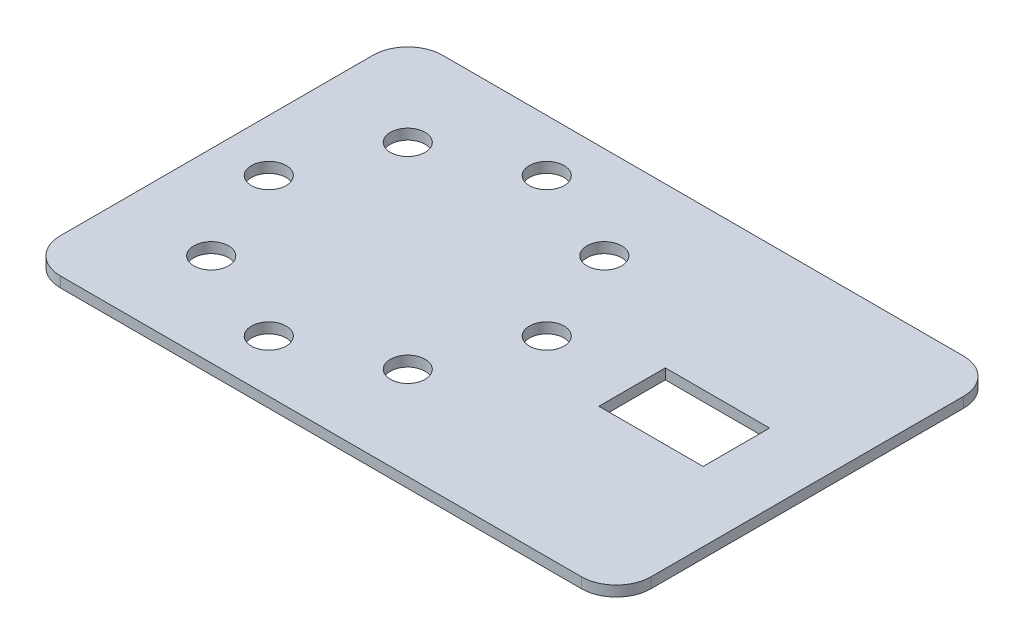
ISO-10303-21;
HEADER;
FILE_DESCRIPTION(('STEP AP214'),'2;1');
FILE_NAME('part.step','',(''),(''),'','','');
FILE_SCHEMA(('AUTOMOTIVE_DESIGN { 1 0 10303 214 1 1 1 1 }'));
ENDSEC;
DATA;
#1=APPLICATION_CONTEXT('core data for automotive mechanical design processes');
#2=APPLICATION_PROTOCOL_DEFINITION('international standard','automotive_design',2000,#1);
#3=PRODUCT_CONTEXT('',#1,'mechanical');
#4=PRODUCT('Part','Part','',(#3));
#5=PRODUCT_RELATED_PRODUCT_CATEGORY('part','',(#4));
#6=PRODUCT_DEFINITION_FORMATION('','',#4);
#7=PRODUCT_DEFINITION_CONTEXT('part definition',#1,'design');
#8=PRODUCT_DEFINITION('design','',#6,#7);
#9=PRODUCT_DEFINITION_SHAPE('','',#8);
#10=(LENGTH_UNIT() NAMED_UNIT(*) SI_UNIT(.MILLI.,.METRE.));
#11=(NAMED_UNIT(*) PLANE_ANGLE_UNIT() SI_UNIT($,.RADIAN.));
#12=(NAMED_UNIT(*) SI_UNIT($,.STERADIAN.) SOLID_ANGLE_UNIT());
#13=UNCERTAINTY_MEASURE_WITH_UNIT(LENGTH_MEASURE(1.E-05),#10,'distance_accuracy_value','');
#14=(GEOMETRIC_REPRESENTATION_CONTEXT(3) GLOBAL_UNCERTAINTY_ASSIGNED_CONTEXT((#13)) GLOBAL_UNIT_ASSIGNED_CONTEXT((#10,
#11,#12)) REPRESENTATION_CONTEXT('',''));
#15=CARTESIAN_POINT('',(0.,0.,0.));
#16=DIRECTION('',(0.,0.,1.));
#17=DIRECTION('',(1.,0.,0.));
#18=AXIS2_PLACEMENT_3D('',#15,#16,#17);
#19=CARTESIAN_POINT('',(0.,1.5,5.));
#20=DIRECTION('',(0.,0.,1.));
#21=DIRECTION('',(1.,0.,0.));
#22=AXIS2_PLACEMENT_3D('',#19,#20,#21);
#23=PLANE('',#22);
#24=DIRECTION('',(-1.,0.,0.));
#25=VECTOR('',#24,1.);
#26=CARTESIAN_POINT('',(0.,0.,5.));
#27=LINE('',#26,#25);
#28=CARTESIAN_POINT('',(32.5,0.,5.));
#29=VERTEX_POINT('',#28);
#30=CARTESIAN_POINT('',(17.5,0.,5.));
#31=VERTEX_POINT('',#30);
#32=EDGE_CURVE('E150',#29,#31,#27,.T.);
#33=ORIENTED_EDGE('',*,*,#32,.T.);
#34=DIRECTION('',(0.,-1.,0.));
#35=VECTOR('',#34,1.);
#36=CARTESIAN_POINT('',(17.5,1.5,5.));
#37=LINE('',#36,#35);
#38=CARTESIAN_POINT('',(17.5,1.5,5.));
#39=VERTEX_POINT('',#38);
#40=EDGE_CURVE('E132',#39,#31,#37,.T.);
#41=ORIENTED_EDGE('',*,*,#40,.F.);
#42=DIRECTION('',(-1.,0.,0.));
#43=VECTOR('',#42,1.);
#44=CARTESIAN_POINT('',(0.,1.5,5.));
#45=LINE('',#44,#43);
#46=CARTESIAN_POINT('',(32.5,1.5,5.));
#47=VERTEX_POINT('',#46);
#48=EDGE_CURVE('E139',#47,#39,#45,.T.);
#49=ORIENTED_EDGE('',*,*,#48,.F.);
#50=DIRECTION('',(0.,-1.,0.));
#51=VECTOR('',#50,1.);
#52=CARTESIAN_POINT('',(32.5,1.5,5.));
#53=LINE('',#52,#51);
#54=EDGE_CURVE('E218',#47,#29,#53,.T.);
#55=ORIENTED_EDGE('',*,*,#54,.T.);
#56=EDGE_LOOP('',(#33,#41,#49,#55));
#57=FACE_BOUND('',#56,.T.);
#58=ADVANCED_FACE('F38',(#57),#23,.F.);
#59=CARTESIAN_POINT('',(17.5,1.5,0.));
#60=DIRECTION('',(-1.,0.,0.));
#61=DIRECTION('',(0.,0.,1.));
#62=AXIS2_PLACEMENT_3D('',#59,#60,#61);
#63=PLANE('',#62);
#64=DIRECTION('',(0.,0.,-1.));
#65=VECTOR('',#64,1.);
#66=CARTESIAN_POINT('',(17.5,0.,0.));
#67=LINE('',#66,#65);
#68=CARTESIAN_POINT('',(17.5,0.,-4.56673306772908));
#69=VERTEX_POINT('',#68);
#70=EDGE_CURVE('E209',#31,#69,#67,.T.);
#71=ORIENTED_EDGE('',*,*,#70,.T.);
#72=DIRECTION('',(0.,-1.,0.));
#73=VECTOR('',#72,1.);
#74=CARTESIAN_POINT('',(17.5,1.5,-4.56673306772908));
#75=LINE('',#74,#73);
#76=CARTESIAN_POINT('',(17.5,1.5,-4.56673306772908));
#77=VERTEX_POINT('',#76);
#78=EDGE_CURVE('E134',#77,#69,#75,.T.);
#79=ORIENTED_EDGE('',*,*,#78,.F.);
#80=DIRECTION('',(0.,0.,-1.));
#81=VECTOR('',#80,1.);
#82=CARTESIAN_POINT('',(17.5,1.5,0.));
#83=LINE('',#82,#81);
#84=EDGE_CURVE('E127',#39,#77,#83,.T.);
#85=ORIENTED_EDGE('',*,*,#84,.F.);
#86=ORIENTED_EDGE('',*,*,#40,.T.);
#87=EDGE_LOOP('',(#71,#79,#85,#86));
#88=FACE_BOUND('',#87,.T.);
#89=ADVANCED_FACE('F130',(#88),#63,.F.);
#90=CARTESIAN_POINT('',(0.,1.5,-4.56673306772907));
#91=DIRECTION('',(0.,0.,1.));
#92=DIRECTION('',(1.,0.,0.));
#93=AXIS2_PLACEMENT_3D('',#90,#91,#92);
#94=PLANE('',#93);
#95=DIRECTION('',(-1.,0.,0.));
#96=VECTOR('',#95,1.);
#97=CARTESIAN_POINT('',(0.,0.,-4.56673306772907));
#98=LINE('',#97,#96);
#99=CARTESIAN_POINT('',(32.5,0.,-4.56673306772908));
#100=VERTEX_POINT('',#99);
#101=EDGE_CURVE('E211',#100,#69,#98,.T.);
#102=ORIENTED_EDGE('',*,*,#101,.F.);
#103=DIRECTION('',(0.,-1.,0.));
#104=VECTOR('',#103,1.);
#105=CARTESIAN_POINT('',(32.5,1.5,-4.56673306772908));
#106=LINE('',#105,#104);
#107=CARTESIAN_POINT('',(32.5,1.5,-4.56673306772908));
#108=VERTEX_POINT('',#107);
#109=EDGE_CURVE('E155',#108,#100,#106,.T.);
#110=ORIENTED_EDGE('',*,*,#109,.F.);
#111=DIRECTION('',(-1.,0.,0.));
#112=VECTOR('',#111,1.);
#113=CARTESIAN_POINT('',(0.,1.5,-4.56673306772907));
#114=LINE('',#113,#112);
#115=EDGE_CURVE('E138',#108,#77,#114,.T.);
#116=ORIENTED_EDGE('',*,*,#115,.T.);
#117=ORIENTED_EDGE('',*,*,#78,.T.);
#118=EDGE_LOOP('',(#102,#110,#116,#117));
#119=FACE_BOUND('',#118,.T.);
#120=ADVANCED_FACE('F224',(#119),#94,.T.);
#121=CARTESIAN_POINT('',(-42.5,1.5,0.));
#122=DIRECTION('',(-1.,0.,0.));
#123=DIRECTION('',(0.,0.,1.));
#124=AXIS2_PLACEMENT_3D('',#121,#122,#123);
#125=PLANE('',#124);
#126=DIRECTION('',(0.,0.,-1.));
#127=VECTOR('',#126,1.);
#128=CARTESIAN_POINT('',(-42.5,1.5,0.));
#129=LINE('',#128,#127);
#130=CARTESIAN_POINT('',(-42.5,1.5,22.5));
#131=VERTEX_POINT('',#130);
#132=CARTESIAN_POINT('',(-42.5,1.5,-22.5));
#133=VERTEX_POINT('',#132);
#134=EDGE_CURVE('E346',#131,#133,#129,.T.);
#135=ORIENTED_EDGE('',*,*,#134,.T.);
#136=DIRECTION('',(0.,-1.,0.));
#137=VECTOR('',#136,1.);
#138=CARTESIAN_POINT('',(-42.5,0.,-22.5));
#139=LINE('',#138,#137);
#140=CARTESIAN_POINT('',(-42.5,0.,-22.5));
#141=VERTEX_POINT('',#140);
#142=EDGE_CURVE('E153',#133,#141,#139,.T.);
#143=ORIENTED_EDGE('',*,*,#142,.T.);
#144=DIRECTION('',(0.,0.,-1.));
#145=VECTOR('',#144,1.);
#146=CARTESIAN_POINT('',(-42.5,0.,0.));
#147=LINE('',#146,#145);
#148=CARTESIAN_POINT('',(-42.5,0.,22.5));
#149=VERTEX_POINT('',#148);
#150=EDGE_CURVE('E204',#149,#141,#147,.T.);
#151=ORIENTED_EDGE('',*,*,#150,.F.);
#152=DIRECTION('',(0.,-1.,0.));
#153=VECTOR('',#152,1.);
#154=CARTESIAN_POINT('',(-42.5,1.5,22.5));
#155=LINE('',#154,#153);
#156=EDGE_CURVE('E151',#149,#131,#155,.F.);
#157=ORIENTED_EDGE('',*,*,#156,.T.);
#158=EDGE_LOOP('',(#135,#143,#151,#157));
#159=FACE_BOUND('',#158,.T.);
#160=ADVANCED_FACE('F259',(#159),#125,.T.);
#161=CARTESIAN_POINT('',(0.,1.5,27.5));
#162=DIRECTION('',(0.,0.,1.));
#163=DIRECTION('',(1.,0.,0.));
#164=AXIS2_PLACEMENT_3D('',#161,#162,#163);
#165=PLANE('',#164);
#166=DIRECTION('',(-1.,0.,0.));
#167=VECTOR('',#166,1.);
#168=CARTESIAN_POINT('',(0.,1.5,27.5));
#169=LINE('',#168,#167);
#170=CARTESIAN_POINT('',(37.5,1.5,27.5));
#171=VERTEX_POINT('',#170);
#172=CARTESIAN_POINT('',(-37.5,1.5,27.5));
#173=VERTEX_POINT('',#172);
#174=EDGE_CURVE('E310',#171,#173,#169,.T.);
#175=ORIENTED_EDGE('',*,*,#174,.T.);
#176=DIRECTION('',(0.,-1.,0.));
#177=VECTOR('',#176,1.);
#178=CARTESIAN_POINT('',(-37.5,1.5,27.5));
#179=LINE('',#178,#177);
#180=CARTESIAN_POINT('',(-37.5,0.,27.5));
#181=VERTEX_POINT('',#180);
#182=EDGE_CURVE('E183',#173,#181,#179,.T.);
#183=ORIENTED_EDGE('',*,*,#182,.T.);
#184=DIRECTION('',(-1.,0.,0.));
#185=VECTOR('',#184,1.);
#186=CARTESIAN_POINT('',(0.,0.,27.5));
#187=LINE('',#186,#185);
#188=CARTESIAN_POINT('',(37.5,0.,27.5));
#189=VERTEX_POINT('',#188);
#190=EDGE_CURVE('E200',#189,#181,#187,.T.);
#191=ORIENTED_EDGE('',*,*,#190,.F.);
#192=DIRECTION('',(0.,-1.,0.));
#193=VECTOR('',#192,1.);
#194=CARTESIAN_POINT('',(37.5,1.5,27.5));
#195=LINE('',#194,#193);
#196=EDGE_CURVE('E181',#189,#171,#195,.F.);
#197=ORIENTED_EDGE('',*,*,#196,.T.);
#198=EDGE_LOOP('',(#175,#183,#191,#197));
#199=FACE_BOUND('',#198,.T.);
#200=ADVANCED_FACE('F256',(#199),#165,.T.);
#201=CARTESIAN_POINT('',(42.5,1.5,0.));
#202=DIRECTION('',(-1.,0.,0.));
#203=DIRECTION('',(0.,0.,1.));
#204=AXIS2_PLACEMENT_3D('',#201,#202,#203);
#205=PLANE('',#204);
#206=DIRECTION('',(0.,0.,-1.));
#207=VECTOR('',#206,1.);
#208=CARTESIAN_POINT('',(42.5,0.,0.));
#209=LINE('',#208,#207);
#210=CARTESIAN_POINT('',(42.5,0.,22.5));
#211=VERTEX_POINT('',#210);
#212=CARTESIAN_POINT('',(42.5,0.,-22.5));
#213=VERTEX_POINT('',#212);
#214=EDGE_CURVE('E189',#211,#213,#209,.T.);
#215=ORIENTED_EDGE('',*,*,#214,.T.);
#216=DIRECTION('',(0.,-1.,0.));
#217=VECTOR('',#216,1.);
#218=CARTESIAN_POINT('',(42.5,1.5,-22.5));
#219=LINE('',#218,#217);
#220=CARTESIAN_POINT('',(42.5,1.5,-22.5));
#221=VERTEX_POINT('',#220);
#222=EDGE_CURVE('E11',#213,#221,#219,.F.);
#223=ORIENTED_EDGE('',*,*,#222,.T.);
#224=DIRECTION('',(0.,0.,-1.));
#225=VECTOR('',#224,1.);
#226=CARTESIAN_POINT('',(42.5,1.5,0.));
#227=LINE('',#226,#225);
#228=CARTESIAN_POINT('',(42.5,1.5,22.5));
#229=VERTEX_POINT('',#228);
#230=EDGE_CURVE('E190',#229,#221,#227,.T.);
#231=ORIENTED_EDGE('',*,*,#230,.F.);
#232=DIRECTION('',(0.,-1.,0.));
#233=VECTOR('',#232,1.);
#234=CARTESIAN_POINT('',(42.5,0.,22.5));
#235=LINE('',#234,#233);
#236=EDGE_CURVE('E46',#229,#211,#235,.T.);
#237=ORIENTED_EDGE('',*,*,#236,.T.);
#238=EDGE_LOOP('',(#215,#223,#231,#237));
#239=FACE_BOUND('',#238,.T.);
#240=ADVANCED_FACE('F188',(#239),#205,.F.);
#241=CARTESIAN_POINT('',(0.,1.5,-27.5));
#242=DIRECTION('',(0.,0.,1.));
#243=DIRECTION('',(1.,0.,0.));
#244=AXIS2_PLACEMENT_3D('',#241,#242,#243);
#245=PLANE('',#244);
#246=DIRECTION('',(-1.,0.,0.));
#247=VECTOR('',#246,1.);
#248=CARTESIAN_POINT('',(0.,0.,-27.5));
#249=LINE('',#248,#247);
#250=CARTESIAN_POINT('',(37.5,0.,-27.5));
#251=VERTEX_POINT('',#250);
#252=CARTESIAN_POINT('',(-37.5,0.,-27.5));
#253=VERTEX_POINT('',#252);
#254=EDGE_CURVE('E199',#251,#253,#249,.T.);
#255=ORIENTED_EDGE('',*,*,#254,.T.);
#256=DIRECTION('',(0.,-1.,0.));
#257=VECTOR('',#256,1.);
#258=CARTESIAN_POINT('',(-37.5,1.5,-27.5));
#259=LINE('',#258,#257);
#260=CARTESIAN_POINT('',(-37.5,1.5,-27.5));
#261=VERTEX_POINT('',#260);
#262=EDGE_CURVE('E172',#253,#261,#259,.F.);
#263=ORIENTED_EDGE('',*,*,#262,.T.);
#264=DIRECTION('',(-1.,0.,0.));
#265=VECTOR('',#264,1.);
#266=CARTESIAN_POINT('',(0.,1.5,-27.5));
#267=LINE('',#266,#265);
#268=CARTESIAN_POINT('',(37.5,1.5,-27.5));
#269=VERTEX_POINT('',#268);
#270=EDGE_CURVE('E147',#269,#261,#267,.T.);
#271=ORIENTED_EDGE('',*,*,#270,.F.);
#272=DIRECTION('',(0.,-1.,0.));
#273=VECTOR('',#272,1.);
#274=CARTESIAN_POINT('',(37.5,1.5,-27.5));
#275=LINE('',#274,#273);
#276=EDGE_CURVE('E169',#269,#251,#275,.T.);
#277=ORIENTED_EDGE('',*,*,#276,.T.);
#278=EDGE_LOOP('',(#255,#263,#271,#277));
#279=FACE_BOUND('',#278,.T.);
#280=ADVANCED_FACE('F249',(#279),#245,.F.);
#281=CARTESIAN_POINT('',(-35.,1.5,0.));
#282=DIRECTION('',(0.,-1.,0.));
#283=DIRECTION('',(0.,0.,-1.));
#284=AXIS2_PLACEMENT_3D('',#281,#282,#283);
#285=CYLINDRICAL_SURFACE('',#284,2.49999999999999);
#286=CARTESIAN_POINT('',(-35.,1.5,0.));
#287=DIRECTION('',(0.,1.,0.));
#288=DIRECTION('',(0.,0.,1.));
#289=AXIS2_PLACEMENT_3D('',#286,#287,#288);
#290=CIRCLE('',#289,2.49999999999999);
#291=CARTESIAN_POINT('',(-35.,1.5,2.5));
#292=VERTEX_POINT('',#291);
#293=EDGE_CURVE('E348',#292,#292,#290,.T.);
#294=ORIENTED_EDGE('',*,*,#293,.T.);
#295=EDGE_LOOP('',(#294));
#296=FACE_BOUND('',#295,.T.);
#297=CARTESIAN_POINT('',(-35.,0.,0.));
#298=DIRECTION('',(0.,1.,0.));
#299=DIRECTION('',(0.,0.,1.));
#300=AXIS2_PLACEMENT_3D('',#297,#298,#299);
#301=CIRCLE('',#300,2.49999999999999);
#302=CARTESIAN_POINT('',(-35.,0.,2.5));
#303=VERTEX_POINT('',#302);
#304=EDGE_CURVE('E336',#303,#303,#301,.T.);
#305=ORIENTED_EDGE('',*,*,#304,.F.);
#306=EDGE_LOOP('',(#305));
#307=FACE_BOUND('',#306,.T.);
#308=ADVANCED_FACE('F252',(#296,#307),#285,.F.);
#309=CARTESIAN_POINT('',(-29.1421356237309,1.5,-14.142135623731));
#310=DIRECTION('',(0.,-1.,0.));
#311=DIRECTION('',(0.,0.,-1.));
#312=AXIS2_PLACEMENT_3D('',#309,#310,#311);
#313=CYLINDRICAL_SURFACE('',#312,2.5);
#314=CARTESIAN_POINT('',(-29.1421356237309,1.5,-14.142135623731));
#315=DIRECTION('',(0.,1.,0.));
#316=DIRECTION('',(0.,0.,1.));
#317=AXIS2_PLACEMENT_3D('',#314,#315,#316);
#318=CIRCLE('',#317,2.5);
#319=CARTESIAN_POINT('',(-29.1421356237309,1.5,-11.642135623731));
#320=VERTEX_POINT('',#319);
#321=EDGE_CURVE('E353',#320,#320,#318,.T.);
#322=ORIENTED_EDGE('',*,*,#321,.T.);
#323=EDGE_LOOP('',(#322));
#324=FACE_BOUND('',#323,.T.);
#325=CARTESIAN_POINT('',(-29.1421356237309,0.,-14.142135623731));
#326=DIRECTION('',(0.,1.,0.));
#327=DIRECTION('',(0.,0.,1.));
#328=AXIS2_PLACEMENT_3D('',#325,#326,#327);
#329=CIRCLE('',#328,2.5);
#330=CARTESIAN_POINT('',(-29.1421356237309,0.,-11.642135623731));
#331=VERTEX_POINT('',#330);
#332=EDGE_CURVE('E333',#331,#331,#329,.T.);
#333=ORIENTED_EDGE('',*,*,#332,.F.);
#334=EDGE_LOOP('',(#333));
#335=FACE_BOUND('',#334,.T.);
#336=ADVANCED_FACE('F266',(#324,#335),#313,.F.);
#337=CARTESIAN_POINT('',(-14.9999999999999,1.5,-20.));
#338=DIRECTION('',(0.,-1.,0.));
#339=DIRECTION('',(0.,0.,-1.));
#340=AXIS2_PLACEMENT_3D('',#337,#338,#339);
#341=CYLINDRICAL_SURFACE('',#340,2.49999999999999);
#342=CARTESIAN_POINT('',(-14.9999999999999,1.5,-20.));
#343=DIRECTION('',(0.,1.,0.));
#344=DIRECTION('',(0.,0.,1.));
#345=AXIS2_PLACEMENT_3D('',#342,#343,#344);
#346=CIRCLE('',#345,2.49999999999999);
#347=CARTESIAN_POINT('',(-14.9999999999999,1.5,-17.5));
#348=VERTEX_POINT('',#347);
#349=EDGE_CURVE('E356',#348,#348,#346,.T.);
#350=ORIENTED_EDGE('',*,*,#349,.T.);
#351=EDGE_LOOP('',(#350));
#352=FACE_BOUND('',#351,.T.);
#353=CARTESIAN_POINT('',(-14.9999999999999,0.,-20.));
#354=DIRECTION('',(0.,1.,0.));
#355=DIRECTION('',(0.,0.,1.));
#356=AXIS2_PLACEMENT_3D('',#353,#354,#355);
#357=CIRCLE('',#356,2.49999999999999);
#358=CARTESIAN_POINT('',(-14.9999999999999,0.,-17.5));
#359=VERTEX_POINT('',#358);
#360=EDGE_CURVE('E330',#359,#359,#357,.T.);
#361=ORIENTED_EDGE('',*,*,#360,.F.);
#362=EDGE_LOOP('',(#361));
#363=FACE_BOUND('',#362,.T.);
#364=ADVANCED_FACE('F270',(#352,#363),#341,.F.);
#365=CARTESIAN_POINT('',(-0.857864376268985,1.5,-14.1421356237309));
#366=DIRECTION('',(0.,-1.,0.));
#367=DIRECTION('',(0.,0.,-1.));
#368=AXIS2_PLACEMENT_3D('',#365,#366,#367);
#369=CYLINDRICAL_SURFACE('',#368,2.49999999999999);
#370=CARTESIAN_POINT('',(-0.857864376268985,1.5,-14.1421356237309));
#371=DIRECTION('',(0.,1.,0.));
#372=DIRECTION('',(0.,0.,1.));
#373=AXIS2_PLACEMENT_3D('',#370,#371,#372);
#374=CIRCLE('',#373,2.49999999999999);
#375=CARTESIAN_POINT('',(-0.857864376268985,1.5,-11.6421356237309));
#376=VERTEX_POINT('',#375);
#377=EDGE_CURVE('E359',#376,#376,#374,.T.);
#378=ORIENTED_EDGE('',*,*,#377,.T.);
#379=EDGE_LOOP('',(#378));
#380=FACE_BOUND('',#379,.T.);
#381=CARTESIAN_POINT('',(-0.857864376268985,0.,-14.1421356237309));
#382=DIRECTION('',(0.,1.,0.));
#383=DIRECTION('',(0.,0.,1.));
#384=AXIS2_PLACEMENT_3D('',#381,#382,#383);
#385=CIRCLE('',#384,2.49999999999999);
#386=CARTESIAN_POINT('',(-0.857864376268985,0.,-11.6421356237309));
#387=VERTEX_POINT('',#386);
#388=EDGE_CURVE('E327',#387,#387,#385,.T.);
#389=ORIENTED_EDGE('',*,*,#388,.F.);
#390=EDGE_LOOP('',(#389));
#391=FACE_BOUND('',#390,.T.);
#392=ADVANCED_FACE('F274',(#380,#391),#369,.F.);
#393=CARTESIAN_POINT('',(4.99999999999999,1.5,1.45630852870683E-13));
#394=DIRECTION('',(0.,-1.,0.));
#395=DIRECTION('',(0.,0.,-1.));
#396=AXIS2_PLACEMENT_3D('',#393,#394,#395);
#397=CYLINDRICAL_SURFACE('',#396,2.5);
#398=CARTESIAN_POINT('',(4.99999999999999,1.5,1.45630852870683E-13));
#399=DIRECTION('',(0.,1.,0.));
#400=DIRECTION('',(0.,0.,1.));
#401=AXIS2_PLACEMENT_3D('',#398,#399,#400);
#402=CIRCLE('',#401,2.5);
#403=CARTESIAN_POINT('',(4.99999999999999,1.5,2.50000000000014));
#404=VERTEX_POINT('',#403);
#405=EDGE_CURVE('E362',#404,#404,#402,.T.);
#406=ORIENTED_EDGE('',*,*,#405,.T.);
#407=EDGE_LOOP('',(#406));
#408=FACE_BOUND('',#407,.T.);
#409=CARTESIAN_POINT('',(4.99999999999999,0.,1.45630852870683E-13));
#410=DIRECTION('',(0.,1.,0.));
#411=DIRECTION('',(0.,0.,1.));
#412=AXIS2_PLACEMENT_3D('',#409,#410,#411);
#413=CIRCLE('',#412,2.5);
#414=CARTESIAN_POINT('',(4.99999999999999,0.,2.50000000000014));
#415=VERTEX_POINT('',#414);
#416=EDGE_CURVE('E324',#415,#415,#413,.T.);
#417=ORIENTED_EDGE('',*,*,#416,.F.);
#418=EDGE_LOOP('',(#417));
#419=FACE_BOUND('',#418,.T.);
#420=ADVANCED_FACE('F278',(#408,#419),#397,.F.);
#421=CARTESIAN_POINT('',(-0.857864376269179,1.5,14.1421356237311));
#422=DIRECTION('',(0.,-1.,0.));
#423=DIRECTION('',(0.,0.,-1.));
#424=AXIS2_PLACEMENT_3D('',#421,#422,#423);
#425=CYLINDRICAL_SURFACE('',#424,2.5);
#426=CARTESIAN_POINT('',(-0.857864376269179,1.5,14.1421356237311));
#427=DIRECTION('',(0.,1.,0.));
#428=DIRECTION('',(0.,0.,1.));
#429=AXIS2_PLACEMENT_3D('',#426,#427,#428);
#430=CIRCLE('',#429,2.5);
#431=CARTESIAN_POINT('',(-0.857864376269179,1.5,16.6421356237311));
#432=VERTEX_POINT('',#431);
#433=EDGE_CURVE('E365',#432,#432,#430,.T.);
#434=ORIENTED_EDGE('',*,*,#433,.T.);
#435=EDGE_LOOP('',(#434));
#436=FACE_BOUND('',#435,.T.);
#437=CARTESIAN_POINT('',(-0.857864376269179,0.,14.1421356237311));
#438=DIRECTION('',(0.,1.,0.));
#439=DIRECTION('',(0.,0.,1.));
#440=AXIS2_PLACEMENT_3D('',#437,#438,#439);
#441=CIRCLE('',#440,2.5);
#442=CARTESIAN_POINT('',(-0.857864376269179,0.,16.6421356237311));
#443=VERTEX_POINT('',#442);
#444=EDGE_CURVE('E321',#443,#443,#441,.T.);
#445=ORIENTED_EDGE('',*,*,#444,.F.);
#446=EDGE_LOOP('',(#445));
#447=FACE_BOUND('',#446,.T.);
#448=ADVANCED_FACE('F282',(#436,#447),#425,.F.);
#449=CARTESIAN_POINT('',(-15.0000000000002,1.5,20.));
#450=DIRECTION('',(0.,-1.,0.));
#451=DIRECTION('',(0.,0.,-1.));
#452=AXIS2_PLACEMENT_3D('',#449,#450,#451);
#453=CYLINDRICAL_SURFACE('',#452,2.49999999999999);
#454=CARTESIAN_POINT('',(-15.0000000000002,1.5,20.));
#455=DIRECTION('',(0.,1.,0.));
#456=DIRECTION('',(0.,0.,1.));
#457=AXIS2_PLACEMENT_3D('',#454,#455,#456);
#458=CIRCLE('',#457,2.49999999999999);
#459=CARTESIAN_POINT('',(-15.0000000000002,1.5,22.5));
#460=VERTEX_POINT('',#459);
#461=EDGE_CURVE('E368',#460,#460,#458,.T.);
#462=ORIENTED_EDGE('',*,*,#461,.T.);
#463=EDGE_LOOP('',(#462));
#464=FACE_BOUND('',#463,.T.);
#465=CARTESIAN_POINT('',(-15.0000000000002,0.,20.));
#466=DIRECTION('',(0.,1.,0.));
#467=DIRECTION('',(0.,0.,1.));
#468=AXIS2_PLACEMENT_3D('',#465,#466,#467);
#469=CIRCLE('',#468,2.49999999999999);
#470=CARTESIAN_POINT('',(-15.0000000000002,0.,22.5));
#471=VERTEX_POINT('',#470);
#472=EDGE_CURVE('E318',#471,#471,#469,.T.);
#473=ORIENTED_EDGE('',*,*,#472,.F.);
#474=EDGE_LOOP('',(#473));
#475=FACE_BOUND('',#474,.T.);
#476=ADVANCED_FACE('F286',(#464,#475),#453,.F.);
#477=CARTESIAN_POINT('',(-29.1421356237311,1.5,14.1421356237308));
#478=DIRECTION('',(0.,-1.,0.));
#479=DIRECTION('',(0.,0.,-1.));
#480=AXIS2_PLACEMENT_3D('',#477,#478,#479);
#481=CYLINDRICAL_SURFACE('',#480,2.49999999999999);
#482=CARTESIAN_POINT('',(-29.1421356237311,1.5,14.1421356237308));
#483=DIRECTION('',(0.,1.,0.));
#484=DIRECTION('',(0.,0.,1.));
#485=AXIS2_PLACEMENT_3D('',#482,#483,#484);
#486=CIRCLE('',#485,2.49999999999999);
#487=CARTESIAN_POINT('',(-29.1421356237311,1.5,16.6421356237308));
#488=VERTEX_POINT('',#487);
#489=EDGE_CURVE('E217',#488,#488,#486,.T.);
#490=ORIENTED_EDGE('',*,*,#489,.T.);
#491=EDGE_LOOP('',(#490));
#492=FACE_BOUND('',#491,.T.);
#493=CARTESIAN_POINT('',(-29.1421356237311,0.,14.1421356237308));
#494=DIRECTION('',(0.,1.,0.));
#495=DIRECTION('',(0.,0.,1.));
#496=AXIS2_PLACEMENT_3D('',#493,#494,#495);
#497=CIRCLE('',#496,2.49999999999999);
#498=CARTESIAN_POINT('',(-29.1421356237311,0.,16.6421356237308));
#499=VERTEX_POINT('',#498);
#500=EDGE_CURVE('E316',#499,#499,#497,.T.);
#501=ORIENTED_EDGE('',*,*,#500,.F.);
#502=EDGE_LOOP('',(#501));
#503=FACE_BOUND('',#502,.T.);
#504=ADVANCED_FACE('F290',(#492,#503),#481,.F.);
#505=CARTESIAN_POINT('',(32.5,1.5,0.));
#506=DIRECTION('',(-1.,0.,0.));
#507=DIRECTION('',(0.,0.,1.));
#508=AXIS2_PLACEMENT_3D('',#505,#506,#507);
#509=PLANE('',#508);
#510=DIRECTION('',(0.,0.,-1.));
#511=VECTOR('',#510,1.);
#512=CARTESIAN_POINT('',(32.5,0.,0.));
#513=LINE('',#512,#511);
#514=EDGE_CURVE('E214',#29,#100,#513,.T.);
#515=ORIENTED_EDGE('',*,*,#514,.F.);
#516=ORIENTED_EDGE('',*,*,#54,.F.);
#517=DIRECTION('',(0.,0.,-1.));
#518=VECTOR('',#517,1.);
#519=CARTESIAN_POINT('',(32.5,1.5,0.));
#520=LINE('',#519,#518);
#521=EDGE_CURVE('E145',#47,#108,#520,.T.);
#522=ORIENTED_EDGE('',*,*,#521,.T.);
#523=ORIENTED_EDGE('',*,*,#109,.T.);
#524=EDGE_LOOP('',(#515,#516,#522,#523));
#525=FACE_BOUND('',#524,.T.);
#526=ADVANCED_FACE('F222',(#525),#509,.T.);
#527=CARTESIAN_POINT('',(0.,1.5,0.));
#528=DIRECTION('',(0.,1.,0.));
#529=DIRECTION('',(0.,0.,1.));
#530=AXIS2_PLACEMENT_3D('',#527,#528,#529);
#531=PLANE('',#530);
#532=ORIENTED_EDGE('',*,*,#489,.F.);
#533=EDGE_LOOP('',(#532));
#534=FACE_BOUND('',#533,.T.);
#535=ORIENTED_EDGE('',*,*,#461,.F.);
#536=EDGE_LOOP('',(#535));
#537=FACE_BOUND('',#536,.T.);
#538=ORIENTED_EDGE('',*,*,#433,.F.);
#539=EDGE_LOOP('',(#538));
#540=FACE_BOUND('',#539,.T.);
#541=ORIENTED_EDGE('',*,*,#405,.F.);
#542=EDGE_LOOP('',(#541));
#543=FACE_BOUND('',#542,.T.);
#544=ORIENTED_EDGE('',*,*,#377,.F.);
#545=EDGE_LOOP('',(#544));
#546=FACE_BOUND('',#545,.T.);
#547=ORIENTED_EDGE('',*,*,#349,.F.);
#548=EDGE_LOOP('',(#547));
#549=FACE_BOUND('',#548,.T.);
#550=ORIENTED_EDGE('',*,*,#321,.F.);
#551=EDGE_LOOP('',(#550));
#552=FACE_BOUND('',#551,.T.);
#553=ORIENTED_EDGE('',*,*,#293,.F.);
#554=EDGE_LOOP('',(#553));
#555=FACE_BOUND('',#554,.T.);
#556=ORIENTED_EDGE('',*,*,#270,.T.);
#557=CARTESIAN_POINT('',(-37.5,1.5,-22.5));
#558=DIRECTION('',(0.,1.,0.));
#559=DIRECTION('',(0.,0.,1.));
#560=AXIS2_PLACEMENT_3D('',#557,#558,#559);
#561=CIRCLE('',#560,5.);
#562=EDGE_CURVE('E179',#261,#133,#561,.T.);
#563=ORIENTED_EDGE('',*,*,#562,.T.);
#564=ORIENTED_EDGE('',*,*,#134,.F.);
#565=CARTESIAN_POINT('',(-37.5,1.5,22.5));
#566=DIRECTION('',(0.,1.,0.));
#567=DIRECTION('',(0.,0.,1.));
#568=AXIS2_PLACEMENT_3D('',#565,#566,#567);
#569=CIRCLE('',#568,5.);
#570=EDGE_CURVE('E177',#131,#173,#569,.T.);
#571=ORIENTED_EDGE('',*,*,#570,.T.);
#572=ORIENTED_EDGE('',*,*,#174,.F.);
#573=CARTESIAN_POINT('',(37.5,1.5,22.5));
#574=DIRECTION('',(0.,1.,0.));
#575=DIRECTION('',(0.,0.,1.));
#576=AXIS2_PLACEMENT_3D('',#573,#574,#575);
#577=CIRCLE('',#576,5.);
#578=EDGE_CURVE('E58',#171,#229,#577,.T.);
#579=ORIENTED_EDGE('',*,*,#578,.T.);
#580=ORIENTED_EDGE('',*,*,#230,.T.);
#581=CARTESIAN_POINT('',(37.5,1.5,-22.5));
#582=DIRECTION('',(0.,1.,0.));
#583=DIRECTION('',(0.,0.,1.));
#584=AXIS2_PLACEMENT_3D('',#581,#582,#583);
#585=CIRCLE('',#584,5.);
#586=EDGE_CURVE('E175',#221,#269,#585,.T.);
#587=ORIENTED_EDGE('',*,*,#586,.T.);
#588=EDGE_LOOP('',(#556,#563,#564,#571,#572,#579,#580,#587));
#589=FACE_BOUND('',#588,.T.);
#590=ORIENTED_EDGE('',*,*,#48,.T.);
#591=ORIENTED_EDGE('',*,*,#84,.T.);
#592=ORIENTED_EDGE('',*,*,#115,.F.);
#593=ORIENTED_EDGE('',*,*,#521,.F.);
#594=EDGE_LOOP('',(#590,#591,#592,#593));
#595=FACE_BOUND('',#594,.T.);
#596=ADVANCED_FACE('F143',(#534,#537,#540,#543,#546,#549,#552,#555,#589,#595),#531,.T.);
#597=CARTESIAN_POINT('',(0.,0.,0.));
#598=DIRECTION('',(0.,1.,0.));
#599=DIRECTION('',(0.,0.,1.));
#600=AXIS2_PLACEMENT_3D('',#597,#598,#599);
#601=PLANE('',#600);
#602=ORIENTED_EDGE('',*,*,#500,.T.);
#603=EDGE_LOOP('',(#602));
#604=FACE_BOUND('',#603,.T.);
#605=ORIENTED_EDGE('',*,*,#472,.T.);
#606=EDGE_LOOP('',(#605));
#607=FACE_BOUND('',#606,.T.);
#608=ORIENTED_EDGE('',*,*,#444,.T.);
#609=EDGE_LOOP('',(#608));
#610=FACE_BOUND('',#609,.T.);
#611=ORIENTED_EDGE('',*,*,#416,.T.);
#612=EDGE_LOOP('',(#611));
#613=FACE_BOUND('',#612,.T.);
#614=ORIENTED_EDGE('',*,*,#388,.T.);
#615=EDGE_LOOP('',(#614));
#616=FACE_BOUND('',#615,.T.);
#617=ORIENTED_EDGE('',*,*,#360,.T.);
#618=EDGE_LOOP('',(#617));
#619=FACE_BOUND('',#618,.T.);
#620=ORIENTED_EDGE('',*,*,#332,.T.);
#621=EDGE_LOOP('',(#620));
#622=FACE_BOUND('',#621,.T.);
#623=ORIENTED_EDGE('',*,*,#304,.T.);
#624=EDGE_LOOP('',(#623));
#625=FACE_BOUND('',#624,.T.);
#626=ORIENTED_EDGE('',*,*,#150,.T.);
#627=CARTESIAN_POINT('',(-37.5,0.,-22.5));
#628=DIRECTION('',(0.,1.,0.));
#629=DIRECTION('',(0.,0.,1.));
#630=AXIS2_PLACEMENT_3D('',#627,#628,#629);
#631=CIRCLE('',#630,5.);
#632=EDGE_CURVE('E167',#141,#253,#631,.F.);
#633=ORIENTED_EDGE('',*,*,#632,.T.);
#634=ORIENTED_EDGE('',*,*,#254,.F.);
#635=CARTESIAN_POINT('',(37.5,0.,-22.5));
#636=DIRECTION('',(0.,1.,0.));
#637=DIRECTION('',(0.,0.,1.));
#638=AXIS2_PLACEMENT_3D('',#635,#636,#637);
#639=CIRCLE('',#638,5.);
#640=EDGE_CURVE('E163',#251,#213,#639,.F.);
#641=ORIENTED_EDGE('',*,*,#640,.T.);
#642=ORIENTED_EDGE('',*,*,#214,.F.);
#643=CARTESIAN_POINT('',(37.5,0.,22.5));
#644=DIRECTION('',(0.,1.,0.));
#645=DIRECTION('',(0.,0.,1.));
#646=AXIS2_PLACEMENT_3D('',#643,#644,#645);
#647=CIRCLE('',#646,5.);
#648=EDGE_CURVE('E161',#211,#189,#647,.F.);
#649=ORIENTED_EDGE('',*,*,#648,.T.);
#650=ORIENTED_EDGE('',*,*,#190,.T.);
#651=CARTESIAN_POINT('',(-37.5,0.,22.5));
#652=DIRECTION('',(0.,1.,0.));
#653=DIRECTION('',(0.,0.,1.));
#654=AXIS2_PLACEMENT_3D('',#651,#652,#653);
#655=CIRCLE('',#654,5.);
#656=EDGE_CURVE('E165',#181,#149,#655,.F.);
#657=ORIENTED_EDGE('',*,*,#656,.T.);
#658=EDGE_LOOP('',(#626,#633,#634,#641,#642,#649,#650,#657));
#659=FACE_BOUND('',#658,.T.);
#660=ORIENTED_EDGE('',*,*,#32,.F.);
#661=ORIENTED_EDGE('',*,*,#514,.T.);
#662=ORIENTED_EDGE('',*,*,#101,.T.);
#663=ORIENTED_EDGE('',*,*,#70,.F.);
#664=EDGE_LOOP('',(#660,#661,#662,#663));
#665=FACE_BOUND('',#664,.T.);
#666=ADVANCED_FACE('F194',(#604,#607,#610,#613,#616,#619,#622,#625,#659,#665),#601,.F.);
#667=CARTESIAN_POINT('',(-37.5,1.5,-22.5));
#668=DIRECTION('',(0.,1.,0.));
#669=DIRECTION('',(0.,0.,1.));
#670=AXIS2_PLACEMENT_3D('',#667,#668,#669);
#671=CYLINDRICAL_SURFACE('',#670,5.);
#672=ORIENTED_EDGE('',*,*,#562,.F.);
#673=ORIENTED_EDGE('',*,*,#262,.F.);
#674=ORIENTED_EDGE('',*,*,#632,.F.);
#675=ORIENTED_EDGE('',*,*,#142,.F.);
#676=EDGE_LOOP('',(#672,#673,#674,#675));
#677=FACE_BOUND('',#676,.T.);
#678=ADVANCED_FACE('F226',(#677),#671,.T.);
#679=CARTESIAN_POINT('',(-37.5,1.5,22.5));
#680=DIRECTION('',(0.,-1.,0.));
#681=DIRECTION('',(0.,0.,-1.));
#682=AXIS2_PLACEMENT_3D('',#679,#680,#681);
#683=CYLINDRICAL_SURFACE('',#682,5.);
#684=ORIENTED_EDGE('',*,*,#570,.F.);
#685=ORIENTED_EDGE('',*,*,#156,.F.);
#686=ORIENTED_EDGE('',*,*,#656,.F.);
#687=ORIENTED_EDGE('',*,*,#182,.F.);
#688=EDGE_LOOP('',(#684,#685,#686,#687));
#689=FACE_BOUND('',#688,.T.);
#690=ADVANCED_FACE('F233',(#689),#683,.T.);
#691=CARTESIAN_POINT('',(37.5,1.5,-22.5));
#692=DIRECTION('',(0.,-1.,0.));
#693=DIRECTION('',(0.,0.,-1.));
#694=AXIS2_PLACEMENT_3D('',#691,#692,#693);
#695=CYLINDRICAL_SURFACE('',#694,5.);
#696=ORIENTED_EDGE('',*,*,#586,.F.);
#697=ORIENTED_EDGE('',*,*,#222,.F.);
#698=ORIENTED_EDGE('',*,*,#640,.F.);
#699=ORIENTED_EDGE('',*,*,#276,.F.);
#700=EDGE_LOOP('',(#696,#697,#698,#699));
#701=FACE_BOUND('',#700,.T.);
#702=ADVANCED_FACE('F296',(#701),#695,.T.);
#703=CARTESIAN_POINT('',(37.5,1.5,22.5));
#704=DIRECTION('',(0.,1.,0.));
#705=DIRECTION('',(0.,0.,1.));
#706=AXIS2_PLACEMENT_3D('',#703,#704,#705);
#707=CYLINDRICAL_SURFACE('',#706,5.);
#708=ORIENTED_EDGE('',*,*,#578,.F.);
#709=ORIENTED_EDGE('',*,*,#196,.F.);
#710=ORIENTED_EDGE('',*,*,#648,.F.);
#711=ORIENTED_EDGE('',*,*,#236,.F.);
#712=EDGE_LOOP('',(#708,#709,#710,#711));
#713=FACE_BOUND('',#712,.T.);
#714=ADVANCED_FACE('F40',(#713),#707,.T.);
#715=CLOSED_SHELL('',(#58,#89,#120,#160,#200,#240,#280,#308,#336,#364,#392,#420,#448,#476,#504,
#526,#596,#666,#678,#690,#702,#714));
#716=MANIFOLD_SOLID_BREP('B2',#715);
#717=ADVANCED_BREP_SHAPE_REPRESENTATION('',(#18,#716),#14);
#718=SHAPE_DEFINITION_REPRESENTATION(#9,#717);
ENDSEC;
END-ISO-10303-21;
